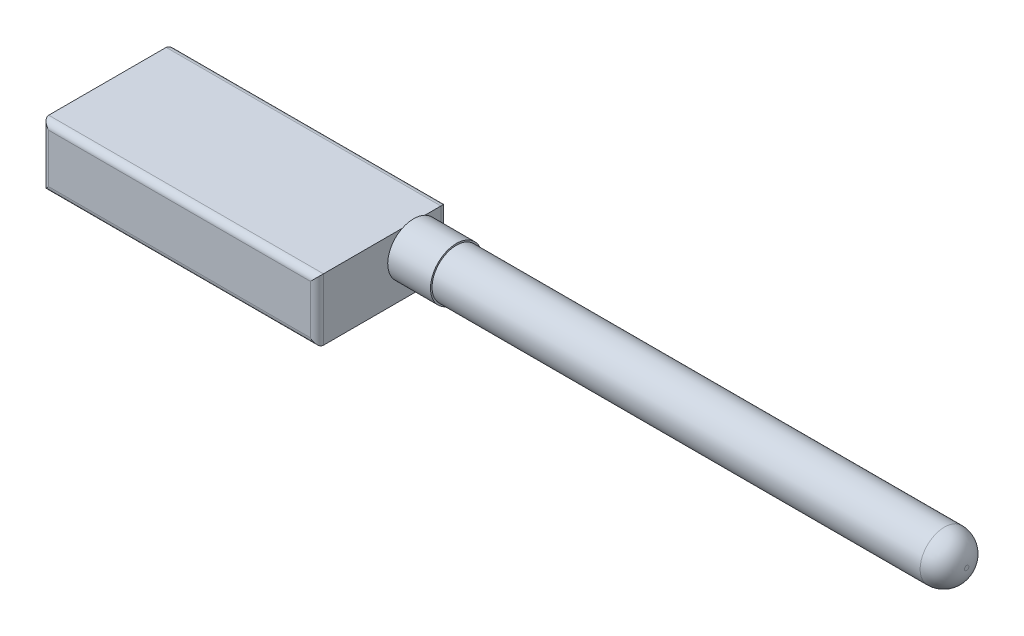
ISO-10303-21;
HEADER;
FILE_DESCRIPTION(('STEP AP214'),'2;1');
FILE_NAME('part.step','',(''),(''),'','','');
FILE_SCHEMA(('AUTOMOTIVE_DESIGN { 1 0 10303 214 1 1 1 1 }'));
ENDSEC;
DATA;
#1=APPLICATION_CONTEXT('core data for automotive mechanical design processes');
#2=APPLICATION_PROTOCOL_DEFINITION('international standard','automotive_design',2000,#1);
#3=PRODUCT_CONTEXT('',#1,'mechanical');
#4=PRODUCT('Part','Part','',(#3));
#5=PRODUCT_RELATED_PRODUCT_CATEGORY('part','',(#4));
#6=PRODUCT_DEFINITION_FORMATION('','',#4);
#7=PRODUCT_DEFINITION_CONTEXT('part definition',#1,'design');
#8=PRODUCT_DEFINITION('design','',#6,#7);
#9=PRODUCT_DEFINITION_SHAPE('','',#8);
#10=(LENGTH_UNIT() NAMED_UNIT(*) SI_UNIT(.MILLI.,.METRE.));
#11=(NAMED_UNIT(*) PLANE_ANGLE_UNIT() SI_UNIT($,.RADIAN.));
#12=(NAMED_UNIT(*) SI_UNIT($,.STERADIAN.) SOLID_ANGLE_UNIT());
#13=UNCERTAINTY_MEASURE_WITH_UNIT(LENGTH_MEASURE(1.E-05),#10,'distance_accuracy_value','');
#14=(GEOMETRIC_REPRESENTATION_CONTEXT(3) GLOBAL_UNCERTAINTY_ASSIGNED_CONTEXT((#13)) GLOBAL_UNIT_ASSIGNED_CONTEXT((#10,
#11,#12)) REPRESENTATION_CONTEXT('',''));
#15=CARTESIAN_POINT('',(0.,0.,0.));
#16=DIRECTION('',(0.,0.,1.));
#17=DIRECTION('',(1.,0.,0.));
#18=AXIS2_PLACEMENT_3D('',#15,#16,#17);
#19=CARTESIAN_POINT('',(-26.1041176470588,12.06,-14.7291176470588));
#20=DIRECTION('',(1.,0.,0.));
#21=DIRECTION('',(0.,0.,-1.));
#22=AXIS2_PLACEMENT_3D('',#19,#20,#21);
#23=PLANE('',#22);
#24=DIRECTION('',(0.,0.,1.));
#25=VECTOR('',#24,1.);
#26=CARTESIAN_POINT('',(-26.1041176470588,12.06,-14.7291176470588));
#27=LINE('',#26,#25);
#28=CARTESIAN_POINT('',(-26.1041176470588,12.06,-13.4591176470588));
#29=VERTEX_POINT('',#28);
#30=CARTESIAN_POINT('',(-26.1041176470588,12.06,9.42088235294118));
#31=VERTEX_POINT('',#30);
#32=EDGE_CURVE('E138',#29,#31,#27,.T.);
#33=ORIENTED_EDGE('',*,*,#32,.F.);
#34=DIRECTION('',(0.,-1.,0.));
#35=VECTOR('',#34,1.);
#36=CARTESIAN_POINT('',(-26.1041176470588,0.,-13.4591176470588));
#37=LINE('',#36,#35);
#38=CARTESIAN_POINT('',(-26.1041176470588,0.,-13.4591176470588));
#39=VERTEX_POINT('',#38);
#40=EDGE_CURVE('E42',#29,#39,#37,.T.);
#41=ORIENTED_EDGE('',*,*,#40,.T.);
#42=DIRECTION('',(0.,0.,1.));
#43=VECTOR('',#42,1.);
#44=CARTESIAN_POINT('',(-26.1041176470588,0.,-14.7291176470588));
#45=LINE('',#44,#43);
#46=CARTESIAN_POINT('',(-26.1041176470588,0.,9.42088235294118));
#47=VERTEX_POINT('',#46);
#48=EDGE_CURVE('E131',#39,#47,#45,.T.);
#49=ORIENTED_EDGE('',*,*,#48,.T.);
#50=DIRECTION('',(0.,-1.,0.));
#51=VECTOR('',#50,1.);
#52=CARTESIAN_POINT('',(-26.1041176470588,12.06,9.42088235294118));
#53=LINE('',#52,#51);
#54=EDGE_CURVE('E158',#47,#31,#53,.F.);
#55=ORIENTED_EDGE('',*,*,#54,.T.);
#56=EDGE_LOOP('',(#33,#41,#49,#55));
#57=FACE_BOUND('',#56,.T.);
#58=ADVANCED_FACE('F33',(#57),#23,.F.);
#59=CARTESIAN_POINT('',(-26.1041176470588,12.06,10.6908823529412));
#60=DIRECTION('',(0.,0.,-1.));
#61=DIRECTION('',(-1.,0.,0.));
#62=AXIS2_PLACEMENT_3D('',#59,#60,#61);
#63=PLANE('',#62);
#64=DIRECTION('',(1.,0.,0.));
#65=VECTOR('',#64,1.);
#66=CARTESIAN_POINT('',(-26.1041176470588,10.79,10.6908823529412));
#67=LINE('',#66,#65);
#68=CARTESIAN_POINT('',(26.1458823529412,10.79,10.6908823529412));
#69=VERTEX_POINT('',#68);
#70=CARTESIAN_POINT('',(-24.8341176470588,10.79,10.6908823529412));
#71=VERTEX_POINT('',#70);
#72=EDGE_CURVE('E153',#69,#71,#67,.F.);
#73=ORIENTED_EDGE('',*,*,#72,.T.);
#74=DIRECTION('',(0.,-1.,0.));
#75=VECTOR('',#74,1.);
#76=CARTESIAN_POINT('',(-24.8341176470588,12.06,10.6908823529412));
#77=LINE('',#76,#75);
#78=CARTESIAN_POINT('',(-24.8341176470588,1.27,10.6908823529412));
#79=VERTEX_POINT('',#78);
#80=EDGE_CURVE('E155',#71,#79,#77,.T.);
#81=ORIENTED_EDGE('',*,*,#80,.T.);
#82=DIRECTION('',(1.,0.,0.));
#83=VECTOR('',#82,1.);
#84=CARTESIAN_POINT('',(-26.1041176470588,1.27,10.6908823529412));
#85=LINE('',#84,#83);
#86=CARTESIAN_POINT('',(26.1458823529412,1.27,10.6908823529412));
#87=VERTEX_POINT('',#86);
#88=EDGE_CURVE('E149',#79,#87,#85,.T.);
#89=ORIENTED_EDGE('',*,*,#88,.T.);
#90=DIRECTION('',(0.,-1.,0.));
#91=VECTOR('',#90,1.);
#92=CARTESIAN_POINT('',(26.1458823529412,12.06,10.6908823529412));
#93=LINE('',#92,#91);
#94=EDGE_CURVE('E151',#87,#69,#93,.F.);
#95=ORIENTED_EDGE('',*,*,#94,.T.);
#96=EDGE_LOOP('',(#73,#81,#89,#95));
#97=FACE_BOUND('',#96,.T.);
#98=ADVANCED_FACE('F223',(#97),#63,.F.);
#99=CARTESIAN_POINT('',(27.4158823529412,12.06,-14.7291176470588));
#100=DIRECTION('',(1.,0.,0.));
#101=DIRECTION('',(0.,0.,-1.));
#102=AXIS2_PLACEMENT_3D('',#99,#100,#101);
#103=PLANE('',#102);
#104=DIRECTION('',(0.,0.,1.));
#105=VECTOR('',#104,1.);
#106=CARTESIAN_POINT('',(27.4158823529412,0.,-14.7291176470588));
#107=LINE('',#106,#105);
#108=CARTESIAN_POINT('',(27.4158823529412,0.,-13.4591176470588));
#109=VERTEX_POINT('',#108);
#110=CARTESIAN_POINT('',(27.4158823529412,0.,9.42088235294118));
#111=VERTEX_POINT('',#110);
#112=EDGE_CURVE('E139',#109,#111,#107,.T.);
#113=ORIENTED_EDGE('',*,*,#112,.F.);
#114=DIRECTION('',(0.,-1.,0.));
#115=VECTOR('',#114,1.);
#116=CARTESIAN_POINT('',(27.4158823529412,12.06,-13.4591176470588));
#117=LINE('',#116,#115);
#118=CARTESIAN_POINT('',(27.4158823529412,12.06,-13.4591176470588));
#119=VERTEX_POINT('',#118);
#120=EDGE_CURVE('E113',#109,#119,#117,.F.);
#121=ORIENTED_EDGE('',*,*,#120,.T.);
#122=DIRECTION('',(0.,0.,1.));
#123=VECTOR('',#122,1.);
#124=CARTESIAN_POINT('',(27.4158823529412,12.06,-14.7291176470588));
#125=LINE('',#124,#123);
#126=CARTESIAN_POINT('',(27.4158823529412,12.06,-10.3500822001659));
#127=VERTEX_POINT('',#126);
#128=EDGE_CURVE('E104',#119,#127,#125,.T.);
#129=ORIENTED_EDGE('',*,*,#128,.T.);
#130=CARTESIAN_POINT('',(27.4158823529412,7.5138,-8.15131764705882));
#131=DIRECTION('',(1.,0.,0.));
#132=DIRECTION('',(0.,0.,-1.));
#133=AXIS2_PLACEMENT_3D('',#130,#131,#132);
#134=CIRCLE('',#133,5.05);
#135=CARTESIAN_POINT('',(27.4158823529412,12.06,-5.95255309395178));
#136=VERTEX_POINT('',#135);
#137=EDGE_CURVE('E110',#136,#127,#134,.T.);
#138=ORIENTED_EDGE('',*,*,#137,.F.);
#139=CARTESIAN_POINT('',(27.4158823529412,12.06,9.42088235294118));
#140=VERTEX_POINT('',#139);
#141=EDGE_CURVE('E116',#136,#140,#125,.T.);
#142=ORIENTED_EDGE('',*,*,#141,.T.);
#143=DIRECTION('',(0.,-1.,0.));
#144=VECTOR('',#143,1.);
#145=CARTESIAN_POINT('',(27.4158823529412,0.,9.42088235294118));
#146=LINE('',#145,#144);
#147=EDGE_CURVE('E163',#140,#111,#146,.T.);
#148=ORIENTED_EDGE('',*,*,#147,.T.);
#149=EDGE_LOOP('',(#113,#121,#129,#138,#142,#148));
#150=FACE_BOUND('',#149,.T.);
#151=ADVANCED_FACE('F107',(#150),#103,.T.);
#152=CARTESIAN_POINT('',(-26.1041176470588,12.06,-14.7291176470588));
#153=DIRECTION('',(0.,0.,-1.));
#154=DIRECTION('',(-1.,0.,0.));
#155=AXIS2_PLACEMENT_3D('',#152,#153,#154);
#156=PLANE('',#155);
#157=DIRECTION('',(1.,0.,0.));
#158=VECTOR('',#157,1.);
#159=CARTESIAN_POINT('',(-26.1041176470588,10.79,-14.7291176470588));
#160=LINE('',#159,#158);
#161=CARTESIAN_POINT('',(-24.8341176470588,10.79,-14.7291176470588));
#162=VERTEX_POINT('',#161);
#163=CARTESIAN_POINT('',(26.1458823529412,10.79,-14.7291176470588));
#164=VERTEX_POINT('',#163);
#165=EDGE_CURVE('E180',#162,#164,#160,.T.);
#166=ORIENTED_EDGE('',*,*,#165,.T.);
#167=DIRECTION('',(0.,-1.,0.));
#168=VECTOR('',#167,1.);
#169=CARTESIAN_POINT('',(26.1458823529412,12.06,-14.7291176470588));
#170=LINE('',#169,#168);
#171=CARTESIAN_POINT('',(26.1458823529412,1.27,-14.7291176470588));
#172=VERTEX_POINT('',#171);
#173=EDGE_CURVE('E182',#164,#172,#170,.T.);
#174=ORIENTED_EDGE('',*,*,#173,.T.);
#175=DIRECTION('',(1.,0.,0.));
#176=VECTOR('',#175,1.);
#177=CARTESIAN_POINT('',(-26.1041176470588,1.27,-14.7291176470588));
#178=LINE('',#177,#176);
#179=CARTESIAN_POINT('',(-24.8341176470588,1.27,-14.7291176470588));
#180=VERTEX_POINT('',#179);
#181=EDGE_CURVE('E169',#172,#180,#178,.F.);
#182=ORIENTED_EDGE('',*,*,#181,.T.);
#183=DIRECTION('',(0.,-1.,0.));
#184=VECTOR('',#183,1.);
#185=CARTESIAN_POINT('',(-24.8341176470588,12.06,-14.7291176470588));
#186=LINE('',#185,#184);
#187=EDGE_CURVE('E178',#180,#162,#186,.F.);
#188=ORIENTED_EDGE('',*,*,#187,.T.);
#189=EDGE_LOOP('',(#166,#174,#182,#188));
#190=FACE_BOUND('',#189,.T.);
#191=ADVANCED_FACE('F215',(#190),#156,.T.);
#192=CARTESIAN_POINT('',(0.,12.06,0.));
#193=DIRECTION('',(0.,1.,0.));
#194=DIRECTION('',(0.,0.,1.));
#195=AXIS2_PLACEMENT_3D('',#192,#193,#194);
#196=PLANE('',#195);
#197=ORIENTED_EDGE('',*,*,#128,.F.);
#198=DIRECTION('',(1.,0.,0.));
#199=VECTOR('',#198,1.);
#200=CARTESIAN_POINT('',(0.,12.06,-13.4591176470588));
#201=LINE('',#200,#199);
#202=EDGE_CURVE('E57',#119,#29,#201,.F.);
#203=ORIENTED_EDGE('',*,*,#202,.T.);
#204=ORIENTED_EDGE('',*,*,#32,.T.);
#205=DIRECTION('',(1.,0.,0.));
#206=VECTOR('',#205,1.);
#207=CARTESIAN_POINT('',(27.4158823529412,12.06,9.42088235294118));
#208=LINE('',#207,#206);
#209=EDGE_CURVE('E161',#31,#140,#208,.T.);
#210=ORIENTED_EDGE('',*,*,#209,.T.);
#211=ORIENTED_EDGE('',*,*,#141,.F.);
#212=EDGE_CURVE('E114',#127,#136,#125,.T.);
#213=ORIENTED_EDGE('',*,*,#212,.F.);
#214=EDGE_LOOP('',(#197,#203,#204,#210,#211,#213));
#215=FACE_BOUND('',#214,.T.);
#216=ADVANCED_FACE('F118',(#215),#196,.T.);
#217=CARTESIAN_POINT('',(0.,0.,0.));
#218=DIRECTION('',(0.,1.,0.));
#219=DIRECTION('',(0.,0.,1.));
#220=AXIS2_PLACEMENT_3D('',#217,#218,#219);
#221=PLANE('',#220);
#222=ORIENTED_EDGE('',*,*,#48,.F.);
#223=DIRECTION('',(1.,0.,0.));
#224=VECTOR('',#223,1.);
#225=CARTESIAN_POINT('',(27.4158823529412,0.,-13.4591176470588));
#226=LINE('',#225,#224);
#227=EDGE_CURVE('E11',#39,#109,#226,.T.);
#228=ORIENTED_EDGE('',*,*,#227,.T.);
#229=ORIENTED_EDGE('',*,*,#112,.T.);
#230=DIRECTION('',(1.,0.,0.));
#231=VECTOR('',#230,1.);
#232=CARTESIAN_POINT('',(0.,0.,9.42088235294118));
#233=LINE('',#232,#231);
#234=EDGE_CURVE('E166',#111,#47,#233,.F.);
#235=ORIENTED_EDGE('',*,*,#234,.T.);
#236=EDGE_LOOP('',(#222,#228,#229,#235));
#237=FACE_BOUND('',#236,.T.);
#238=ADVANCED_FACE('F208',(#237),#221,.F.);
#239=CARTESIAN_POINT('',(27.4158823529412,7.5138,-8.15131764705882));
#240=DIRECTION('',(1.,0.,0.));
#241=DIRECTION('',(0.,0.,-1.));
#242=AXIS2_PLACEMENT_3D('',#239,#240,#241);
#243=PLANE('',#242);
#244=EDGE_CURVE('E124',#127,#136,#134,.T.);
#245=ORIENTED_EDGE('',*,*,#244,.F.);
#246=ORIENTED_EDGE('',*,*,#212,.T.);
#247=EDGE_LOOP('',(#245,#246));
#248=FACE_BOUND('',#247,.T.);
#249=ADVANCED_FACE('F127',(#248),#243,.F.);
#250=CARTESIAN_POINT('',(35.7458823529412,7.5138,-8.15131764705882));
#251=DIRECTION('',(-1.,0.,0.));
#252=DIRECTION('',(0.,0.,1.));
#253=AXIS2_PLACEMENT_3D('',#250,#251,#252);
#254=CYLINDRICAL_SURFACE('',#253,5.05);
#255=CARTESIAN_POINT('',(35.7458823529412,7.5138,-8.15131764705882));
#256=DIRECTION('',(1.,0.,0.));
#257=DIRECTION('',(0.,0.,-1.));
#258=AXIS2_PLACEMENT_3D('',#255,#256,#257);
#259=CIRCLE('',#258,5.05);
#260=CARTESIAN_POINT('',(35.7458823529412,7.5138,-13.2013176470588));
#261=VERTEX_POINT('',#260);
#262=EDGE_CURVE('E128',#261,#261,#259,.T.);
#263=ORIENTED_EDGE('',*,*,#262,.F.);
#264=EDGE_LOOP('',(#263));
#265=FACE_BOUND('',#264,.T.);
#266=ORIENTED_EDGE('',*,*,#244,.T.);
#267=ORIENTED_EDGE('',*,*,#137,.T.);
#268=EDGE_LOOP('',(#266,#267));
#269=FACE_BOUND('',#268,.T.);
#270=ADVANCED_FACE('F123',(#265,#269),#254,.T.);
#271=CARTESIAN_POINT('',(35.7458823529412,7.5138,-8.15131764705882));
#272=DIRECTION('',(1.,0.,0.));
#273=DIRECTION('',(0.,0.,-1.));
#274=AXIS2_PLACEMENT_3D('',#271,#272,#273);
#275=PLANE('',#274);
#276=CARTESIAN_POINT('',(35.7458823529412,7.5138,-8.15131764705882));
#277=DIRECTION('',(1.,0.,0.));
#278=DIRECTION('',(0.,0.,-1.));
#279=AXIS2_PLACEMENT_3D('',#276,#277,#278);
#280=CIRCLE('',#279,4.745);
#281=CARTESIAN_POINT('',(35.7458823529412,7.5138,-12.8963176470588));
#282=VERTEX_POINT('',#281);
#283=EDGE_CURVE('E125',#282,#282,#280,.T.);
#284=ORIENTED_EDGE('',*,*,#283,.F.);
#285=EDGE_LOOP('',(#284));
#286=FACE_BOUND('',#285,.T.);
#287=ORIENTED_EDGE('',*,*,#262,.T.);
#288=EDGE_LOOP('',(#287));
#289=FACE_BOUND('',#288,.T.);
#290=ADVANCED_FACE('F300',(#286,#289),#275,.T.);
#291=CARTESIAN_POINT('',(47.7458823529412,7.5138,-8.15131764705882));
#292=DIRECTION('',(-1.,0.,0.));
#293=DIRECTION('',(0.,0.,1.));
#294=AXIS2_PLACEMENT_3D('',#291,#292,#293);
#295=CYLINDRICAL_SURFACE('',#294,4.745);
#296=CARTESIAN_POINT('',(130.827882352941,7.5138,-8.15131764705882));
#297=DIRECTION('',(1.,0.,0.));
#298=DIRECTION('',(0.,0.,-1.));
#299=AXIS2_PLACEMENT_3D('',#296,#297,#298);
#300=CIRCLE('',#299,4.745);
#301=CARTESIAN_POINT('',(130.827882352941,7.5138,-12.8963176470588));
#302=VERTEX_POINT('',#301);
#303=EDGE_CURVE('E146',#302,#302,#300,.F.);
#304=ORIENTED_EDGE('',*,*,#303,.T.);
#305=EDGE_LOOP('',(#304));
#306=FACE_BOUND('',#305,.T.);
#307=ORIENTED_EDGE('',*,*,#283,.T.);
#308=EDGE_LOOP('',(#307));
#309=FACE_BOUND('',#308,.T.);
#310=ADVANCED_FACE('F292',(#306,#309),#295,.T.);
#311=CARTESIAN_POINT('',(135.145882352941,7.5138,-8.15131764705882));
#312=DIRECTION('',(1.,0.,0.));
#313=DIRECTION('',(0.,0.,-1.));
#314=AXIS2_PLACEMENT_3D('',#311,#312,#313);
#315=PLANE('',#314);
#316=CARTESIAN_POINT('',(135.145882352941,7.5138,-8.15131764705882));
#317=DIRECTION('',(1.,0.,0.));
#318=DIRECTION('',(0.,0.,-1.));
#319=AXIS2_PLACEMENT_3D('',#316,#317,#318);
#320=CIRCLE('',#319,0.426999999999999);
#321=CARTESIAN_POINT('',(135.145882352941,7.5138,-8.57831764705882));
#322=VERTEX_POINT('',#321);
#323=EDGE_CURVE('E143',#322,#322,#320,.T.);
#324=ORIENTED_EDGE('',*,*,#323,.T.);
#325=EDGE_LOOP('',(#324));
#326=FACE_BOUND('',#325,.T.);
#327=ADVANCED_FACE('F238',(#326),#315,.T.);
#328=CARTESIAN_POINT('',(130.827882352941,7.5138,-8.15131764705882));
#329=DIRECTION('',(1.,0.,0.));
#330=DIRECTION('',(0.,0.,-1.));
#331=AXIS2_PLACEMENT_3D('',#328,#329,#330);
#332=DEGENERATE_TOROIDAL_SURFACE('',#331,0.426999999999999,4.318,.T.);
#333=ORIENTED_EDGE('',*,*,#303,.F.);
#334=EDGE_LOOP('',(#333));
#335=FACE_BOUND('',#334,.T.);
#336=ORIENTED_EDGE('',*,*,#323,.F.);
#337=EDGE_LOOP('',(#336));
#338=FACE_BOUND('',#337,.T.);
#339=ADVANCED_FACE('F234',(#335,#338),#332,.T.);
#340=CARTESIAN_POINT('',(26.1458823529412,12.06,9.42088235294118));
#341=DIRECTION('',(0.,1.,0.));
#342=DIRECTION('',(0.,0.,1.));
#343=AXIS2_PLACEMENT_3D('',#340,#341,#342);
#344=CYLINDRICAL_SURFACE('',#343,1.27);
#345=CARTESIAN_POINT('',(26.1458823529412,1.27,9.42088235294118));
#346=DIRECTION('',(0.707106781186547,0.707106781186547,0.));
#347=DIRECTION('',(0.707106781186547,-0.707106781186547,0.));
#348=AXIS2_PLACEMENT_3D('',#345,#346,#347);
#349=ELLIPSE('',#348,1.79605122421383,1.27);
#350=EDGE_CURVE('E134',#111,#87,#349,.F.);
#351=ORIENTED_EDGE('',*,*,#350,.F.);
#352=ORIENTED_EDGE('',*,*,#147,.F.);
#353=CARTESIAN_POINT('',(26.1458823529412,10.79,9.42088235294118));
#354=DIRECTION('',(-0.707106781186547,0.707106781186547,0.));
#355=DIRECTION('',(0.707106781186547,0.707106781186547,0.));
#356=AXIS2_PLACEMENT_3D('',#353,#354,#355);
#357=ELLIPSE('',#356,1.79605122421383,1.27);
#358=EDGE_CURVE('E129',#69,#140,#357,.T.);
#359=ORIENTED_EDGE('',*,*,#358,.F.);
#360=ORIENTED_EDGE('',*,*,#94,.F.);
#361=EDGE_LOOP('',(#351,#352,#359,#360));
#362=FACE_BOUND('',#361,.T.);
#363=ADVANCED_FACE('F237',(#362),#344,.T.);
#364=CARTESIAN_POINT('',(0.,10.79,9.42088235294118));
#365=DIRECTION('',(-1.,0.,0.));
#366=DIRECTION('',(0.,0.,1.));
#367=AXIS2_PLACEMENT_3D('',#364,#365,#366);
#368=CYLINDRICAL_SURFACE('',#367,1.27);
#369=ORIENTED_EDGE('',*,*,#358,.T.);
#370=ORIENTED_EDGE('',*,*,#209,.F.);
#371=CARTESIAN_POINT('',(-24.8341176470588,10.79,9.42088235294118));
#372=DIRECTION('',(-0.707106781186547,-0.707106781186547,0.));
#373=DIRECTION('',(-0.707106781186547,0.707106781186547,0.));
#374=AXIS2_PLACEMENT_3D('',#371,#372,#373);
#375=ELLIPSE('',#374,1.79605122421383,1.27);
#376=EDGE_CURVE('E172',#71,#31,#375,.T.);
#377=ORIENTED_EDGE('',*,*,#376,.F.);
#378=ORIENTED_EDGE('',*,*,#72,.F.);
#379=EDGE_LOOP('',(#369,#370,#377,#378));
#380=FACE_BOUND('',#379,.T.);
#381=ADVANCED_FACE('F247',(#380),#368,.T.);
#382=CARTESIAN_POINT('',(-26.1041176470588,1.27,9.42088235294118));
#383=DIRECTION('',(1.,0.,0.));
#384=DIRECTION('',(0.,0.,-1.));
#385=AXIS2_PLACEMENT_3D('',#382,#383,#384);
#386=CYLINDRICAL_SURFACE('',#385,1.27);
#387=ORIENTED_EDGE('',*,*,#350,.T.);
#388=ORIENTED_EDGE('',*,*,#88,.F.);
#389=CARTESIAN_POINT('',(-24.8341176470588,1.27,9.42088235294118));
#390=DIRECTION('',(0.707106781186547,-0.707106781186547,0.));
#391=DIRECTION('',(0.707106781186547,0.707106781186547,0.));
#392=AXIS2_PLACEMENT_3D('',#389,#390,#391);
#393=ELLIPSE('',#392,1.79605122421383,1.27);
#394=EDGE_CURVE('E170',#47,#79,#393,.F.);
#395=ORIENTED_EDGE('',*,*,#394,.F.);
#396=ORIENTED_EDGE('',*,*,#234,.F.);
#397=EDGE_LOOP('',(#387,#388,#395,#396));
#398=FACE_BOUND('',#397,.T.);
#399=ADVANCED_FACE('F243',(#398),#386,.T.);
#400=CARTESIAN_POINT('',(-24.8341176470588,12.06,9.42088235294118));
#401=DIRECTION('',(0.,-1.,0.));
#402=DIRECTION('',(0.,0.,-1.));
#403=AXIS2_PLACEMENT_3D('',#400,#401,#402);
#404=CYLINDRICAL_SURFACE('',#403,1.27);
#405=ORIENTED_EDGE('',*,*,#376,.T.);
#406=ORIENTED_EDGE('',*,*,#54,.F.);
#407=ORIENTED_EDGE('',*,*,#394,.T.);
#408=ORIENTED_EDGE('',*,*,#80,.F.);
#409=EDGE_LOOP('',(#405,#406,#407,#408));
#410=FACE_BOUND('',#409,.T.);
#411=ADVANCED_FACE('F240',(#410),#404,.T.);
#412=CARTESIAN_POINT('',(-24.8341176470588,12.06,-13.4591176470588));
#413=DIRECTION('',(0.,1.,0.));
#414=DIRECTION('',(0.,0.,1.));
#415=AXIS2_PLACEMENT_3D('',#412,#413,#414);
#416=CYLINDRICAL_SURFACE('',#415,1.27);
#417=CARTESIAN_POINT('',(-24.8341176470588,1.27,-13.4591176470588));
#418=DIRECTION('',(-0.707106781186547,0.707106781186547,0.));
#419=DIRECTION('',(-0.707106781186547,-0.707106781186547,0.));
#420=AXIS2_PLACEMENT_3D('',#417,#418,#419);
#421=ELLIPSE('',#420,1.79605122421383,1.27);
#422=EDGE_CURVE('E191',#39,#180,#421,.F.);
#423=ORIENTED_EDGE('',*,*,#422,.F.);
#424=ORIENTED_EDGE('',*,*,#40,.F.);
#425=CARTESIAN_POINT('',(-24.8341176470588,10.79,-13.4591176470588));
#426=DIRECTION('',(0.707106781186547,0.707106781186547,0.));
#427=DIRECTION('',(-0.707106781186547,0.707106781186547,0.));
#428=AXIS2_PLACEMENT_3D('',#425,#426,#427);
#429=ELLIPSE('',#428,1.79605122421383,1.27);
#430=EDGE_CURVE('E37',#162,#29,#429,.T.);
#431=ORIENTED_EDGE('',*,*,#430,.F.);
#432=ORIENTED_EDGE('',*,*,#187,.F.);
#433=EDGE_LOOP('',(#423,#424,#431,#432));
#434=FACE_BOUND('',#433,.T.);
#435=ADVANCED_FACE('F35',(#434),#416,.T.);
#436=CARTESIAN_POINT('',(-26.1041176470588,10.79,-13.4591176470588));
#437=DIRECTION('',(1.,0.,0.));
#438=DIRECTION('',(0.,0.,-1.));
#439=AXIS2_PLACEMENT_3D('',#436,#437,#438);
#440=CYLINDRICAL_SURFACE('',#439,1.27);
#441=ORIENTED_EDGE('',*,*,#430,.T.);
#442=ORIENTED_EDGE('',*,*,#202,.F.);
#443=CARTESIAN_POINT('',(26.1458823529412,10.79,-13.4591176470588));
#444=DIRECTION('',(0.707106781186547,-0.707106781186547,0.));
#445=DIRECTION('',(0.707106781186547,0.707106781186547,0.));
#446=AXIS2_PLACEMENT_3D('',#443,#444,#445);
#447=ELLIPSE('',#446,1.79605122421383,1.27);
#448=EDGE_CURVE('E190',#164,#119,#447,.T.);
#449=ORIENTED_EDGE('',*,*,#448,.F.);
#450=ORIENTED_EDGE('',*,*,#165,.F.);
#451=EDGE_LOOP('',(#441,#442,#449,#450));
#452=FACE_BOUND('',#451,.T.);
#453=ADVANCED_FACE('F201',(#452),#440,.T.);
#454=CARTESIAN_POINT('',(0.,1.27,-13.4591176470588));
#455=DIRECTION('',(-1.,0.,0.));
#456=DIRECTION('',(0.,0.,1.));
#457=AXIS2_PLACEMENT_3D('',#454,#455,#456);
#458=CYLINDRICAL_SURFACE('',#457,1.27);
#459=ORIENTED_EDGE('',*,*,#422,.T.);
#460=ORIENTED_EDGE('',*,*,#181,.F.);
#461=CARTESIAN_POINT('',(26.1458823529412,1.27,-13.4591176470588));
#462=DIRECTION('',(-0.707106781186547,-0.707106781186547,0.));
#463=DIRECTION('',(-0.707106781186547,0.707106781186547,0.));
#464=AXIS2_PLACEMENT_3D('',#461,#462,#463);
#465=ELLIPSE('',#464,1.79605122421383,1.27);
#466=EDGE_CURVE('E188',#109,#172,#465,.F.);
#467=ORIENTED_EDGE('',*,*,#466,.F.);
#468=ORIENTED_EDGE('',*,*,#227,.F.);
#469=EDGE_LOOP('',(#459,#460,#467,#468));
#470=FACE_BOUND('',#469,.T.);
#471=ADVANCED_FACE('F206',(#470),#458,.T.);
#472=CARTESIAN_POINT('',(26.1458823529412,12.06,-13.4591176470588));
#473=DIRECTION('',(0.,-1.,0.));
#474=DIRECTION('',(0.,0.,-1.));
#475=AXIS2_PLACEMENT_3D('',#472,#473,#474);
#476=CYLINDRICAL_SURFACE('',#475,1.27);
#477=ORIENTED_EDGE('',*,*,#448,.T.);
#478=ORIENTED_EDGE('',*,*,#120,.F.);
#479=ORIENTED_EDGE('',*,*,#466,.T.);
#480=ORIENTED_EDGE('',*,*,#173,.F.);
#481=EDGE_LOOP('',(#477,#478,#479,#480));
#482=FACE_BOUND('',#481,.T.);
#483=ADVANCED_FACE('F212',(#482),#476,.T.);
#484=CLOSED_SHELL('',(#58,#98,#151,#191,#216,#238,#249,#270,#290,#310,#327,#339,#363,#381,#399,
#411,#435,#453,#471,#483));
#485=MANIFOLD_SOLID_BREP('B2',#484);
#486=ADVANCED_BREP_SHAPE_REPRESENTATION('',(#18,#485),#14);
#487=SHAPE_DEFINITION_REPRESENTATION(#9,#486);
ENDSEC;
END-ISO-10303-21;
